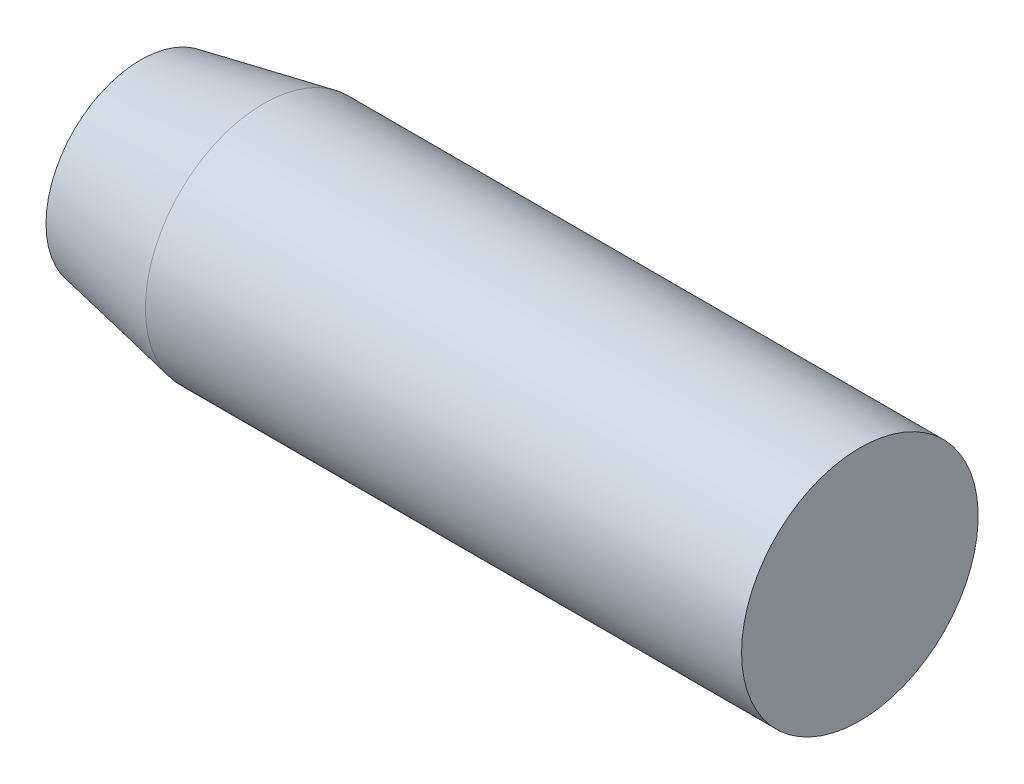
ISO-10303-21;
HEADER;
FILE_DESCRIPTION(('STEP AP214'),'2;1');
FILE_NAME('part.step','',(''),(''),'','','');
FILE_SCHEMA(('AUTOMOTIVE_DESIGN { 1 0 10303 214 1 1 1 1 }'));
ENDSEC;
DATA;
#1=APPLICATION_CONTEXT('core data for automotive mechanical design processes');
#2=APPLICATION_PROTOCOL_DEFINITION('international standard','automotive_design',2000,#1);
#3=PRODUCT_CONTEXT('',#1,'mechanical');
#4=PRODUCT('Part','Part','',(#3));
#5=PRODUCT_RELATED_PRODUCT_CATEGORY('part','',(#4));
#6=PRODUCT_DEFINITION_FORMATION('','',#4);
#7=PRODUCT_DEFINITION_CONTEXT('part definition',#1,'design');
#8=PRODUCT_DEFINITION('design','',#6,#7);
#9=PRODUCT_DEFINITION_SHAPE('','',#8);
#10=(LENGTH_UNIT() NAMED_UNIT(*) SI_UNIT(.MILLI.,.METRE.));
#11=(NAMED_UNIT(*) PLANE_ANGLE_UNIT() SI_UNIT($,.RADIAN.));
#12=(NAMED_UNIT(*) SI_UNIT($,.STERADIAN.) SOLID_ANGLE_UNIT());
#13=UNCERTAINTY_MEASURE_WITH_UNIT(LENGTH_MEASURE(1.E-05),#10,'distance_accuracy_value','');
#14=(GEOMETRIC_REPRESENTATION_CONTEXT(3) GLOBAL_UNCERTAINTY_ASSIGNED_CONTEXT((#13)) GLOBAL_UNIT_ASSIGNED_CONTEXT((#10,
#11,#12)) REPRESENTATION_CONTEXT('',''));
#15=CARTESIAN_POINT('',(0.,0.,0.));
#16=DIRECTION('',(0.,0.,1.));
#17=DIRECTION('',(1.,0.,0.));
#18=AXIS2_PLACEMENT_3D('',#15,#16,#17);
#19=CARTESIAN_POINT('',(0.,0.,-5.));
#20=DIRECTION('',(1.,0.,0.));
#21=DIRECTION('',(0.,0.,-1.));
#22=AXIS2_PLACEMENT_3D('',#19,#20,#21);
#23=PLANE('',#22);
#24=CARTESIAN_POINT('',(0.,0.,0.));
#25=DIRECTION('',(-1.,0.,0.));
#26=DIRECTION('',(0.,0.,1.));
#27=AXIS2_PLACEMENT_3D('',#24,#25,#26);
#28=CIRCLE('',#27,5.);
#29=CARTESIAN_POINT('',(0.,0.,5.));
#30=VERTEX_POINT('',#29);
#31=EDGE_CURVE('E51',#30,#30,#28,.T.);
#32=ORIENTED_EDGE('',*,*,#31,.T.);
#33=EDGE_LOOP('',(#32));
#34=FACE_BOUND('',#33,.T.);
#35=ADVANCED_FACE('F41',(#34),#23,.F.);
#36=CARTESIAN_POINT('',(38.,0.,0.));
#37=DIRECTION('',(-1.,0.,0.));
#38=DIRECTION('',(0.,0.,1.));
#39=AXIS2_PLACEMENT_3D('',#36,#37,#38);
#40=PLANE('',#39);
#41=CARTESIAN_POINT('',(38.,0.,0.));
#42=DIRECTION('',(-1.,0.,0.));
#43=DIRECTION('',(0.,0.,1.));
#44=AXIS2_PLACEMENT_3D('',#41,#42,#43);
#45=CIRCLE('',#44,6.25);
#46=CARTESIAN_POINT('',(38.,0.,6.25));
#47=VERTEX_POINT('',#46);
#48=EDGE_CURVE('E10',#47,#47,#45,.T.);
#49=ORIENTED_EDGE('',*,*,#48,.F.);
#50=EDGE_LOOP('',(#49));
#51=FACE_BOUND('',#50,.T.);
#52=ADVANCED_FACE('F66',(#51),#40,.F.);
#53=CARTESIAN_POINT('',(0.,0.,0.));
#54=DIRECTION('',(-1.,0.,0.));
#55=DIRECTION('',(0.,0.,1.));
#56=AXIS2_PLACEMENT_3D('',#53,#54,#55);
#57=CYLINDRICAL_SURFACE('',#56,6.25);
#58=CARTESIAN_POINT('',(6.5,0.,0.));
#59=DIRECTION('',(-1.,0.,0.));
#60=DIRECTION('',(0.,0.,1.));
#61=AXIS2_PLACEMENT_3D('',#58,#59,#60);
#62=CIRCLE('',#61,6.24999999999999);
#63=CARTESIAN_POINT('',(6.5,0.,6.24999999999999));
#64=VERTEX_POINT('',#63);
#65=EDGE_CURVE('E47',#64,#64,#62,.T.);
#66=ORIENTED_EDGE('',*,*,#65,.F.);
#67=EDGE_LOOP('',(#66));
#68=FACE_BOUND('',#67,.T.);
#69=ORIENTED_EDGE('',*,*,#48,.T.);
#70=EDGE_LOOP('',(#69));
#71=FACE_BOUND('',#70,.T.);
#72=ADVANCED_FACE('F61',(#68,#71),#57,.T.);
#73=CARTESIAN_POINT('',(6.5,0.,0.));
#74=DIRECTION('',(1.,0.,0.));
#75=DIRECTION('',(0.,0.,-1.));
#76=AXIS2_PLACEMENT_3D('',#73,#74,#75);
#77=CONICAL_SURFACE('',#76,6.24999999999999,0.189988287918715);
#78=ORIENTED_EDGE('',*,*,#31,.F.);
#79=EDGE_LOOP('',(#78));
#80=FACE_BOUND('',#79,.T.);
#81=ORIENTED_EDGE('',*,*,#65,.T.);
#82=EDGE_LOOP('',(#81));
#83=FACE_BOUND('',#82,.T.);
#84=ADVANCED_FACE('F59',(#80,#83),#77,.T.);
#85=CLOSED_SHELL('',(#35,#52,#72,#84));
#86=MANIFOLD_SOLID_BREP('B2',#85);
#87=ADVANCED_BREP_SHAPE_REPRESENTATION('',(#18,#86),#14);
#88=SHAPE_DEFINITION_REPRESENTATION(#9,#87);
ENDSEC;
END-ISO-10303-21;
